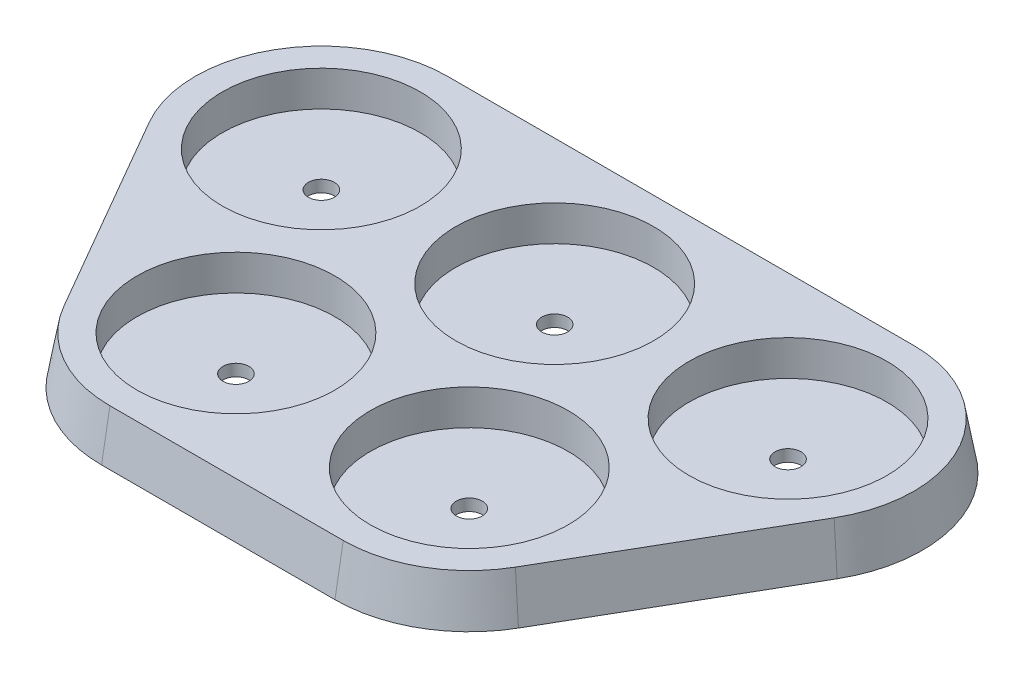
ISO-10303-21;
HEADER;
FILE_DESCRIPTION(('STEP AP214'),'2;1');
FILE_NAME('part.step','',(''),(''),'','','');
FILE_SCHEMA(('AUTOMOTIVE_DESIGN { 1 0 10303 214 1 1 1 1 }'));
ENDSEC;
DATA;
#1=APPLICATION_CONTEXT('core data for automotive mechanical design processes');
#2=APPLICATION_PROTOCOL_DEFINITION('international standard','automotive_design',2000,#1);
#3=PRODUCT_CONTEXT('',#1,'mechanical');
#4=PRODUCT('Part','Part','',(#3));
#5=PRODUCT_RELATED_PRODUCT_CATEGORY('part','',(#4));
#6=PRODUCT_DEFINITION_FORMATION('','',#4);
#7=PRODUCT_DEFINITION_CONTEXT('part definition',#1,'design');
#8=PRODUCT_DEFINITION('design','',#6,#7);
#9=PRODUCT_DEFINITION_SHAPE('','',#8);
#10=(LENGTH_UNIT() NAMED_UNIT(*) SI_UNIT(.MILLI.,.METRE.));
#11=(NAMED_UNIT(*) PLANE_ANGLE_UNIT() SI_UNIT($,.RADIAN.));
#12=(NAMED_UNIT(*) SI_UNIT($,.STERADIAN.) SOLID_ANGLE_UNIT());
#13=UNCERTAINTY_MEASURE_WITH_UNIT(LENGTH_MEASURE(1.E-05),#10,'distance_accuracy_value','');
#14=(GEOMETRIC_REPRESENTATION_CONTEXT(3) GLOBAL_UNCERTAINTY_ASSIGNED_CONTEXT((#13)) GLOBAL_UNIT_ASSIGNED_CONTEXT((#10,
#11,#12)) REPRESENTATION_CONTEXT('',''));
#15=CARTESIAN_POINT('',(0.,0.,0.));
#16=DIRECTION('',(0.,0.,1.));
#17=DIRECTION('',(1.,0.,0.));
#18=AXIS2_PLACEMENT_3D('',#15,#16,#17);
#19=CARTESIAN_POINT('',(-9.90000000000008,0.,17.1473029949318));
#20=DIRECTION('',(0.,1.,0.));
#21=DIRECTION('',(0.,0.,1.));
#22=AXIS2_PLACEMENT_3D('',#19,#20,#21);
#23=CYLINDRICAL_SURFACE('',#22,1.1);
#24=CARTESIAN_POINT('',(-9.90000000000008,0.,17.1473029949318));
#25=DIRECTION('',(0.,1.,0.));
#26=DIRECTION('',(0.,0.,1.));
#27=AXIS2_PLACEMENT_3D('',#24,#25,#26);
#28=CIRCLE('',#27,1.1);
#29=CARTESIAN_POINT('',(-9.90000000000008,0.,18.2473029949318));
#30=VERTEX_POINT('',#29);
#31=EDGE_CURVE('E154',#30,#30,#28,.T.);
#32=ORIENTED_EDGE('',*,*,#31,.F.);
#33=EDGE_LOOP('',(#32));
#34=FACE_BOUND('',#33,.T.);
#35=CARTESIAN_POINT('',(-9.90000000000008,1.,17.1473029949318));
#36=DIRECTION('',(0.,1.,0.));
#37=DIRECTION('',(0.,0.,1.));
#38=AXIS2_PLACEMENT_3D('',#35,#36,#37);
#39=CIRCLE('',#38,1.1);
#40=CARTESIAN_POINT('',(-9.90000000000008,1.,18.2473029949318));
#41=VERTEX_POINT('',#40);
#42=EDGE_CURVE('E336',#41,#41,#39,.T.);
#43=ORIENTED_EDGE('',*,*,#42,.T.);
#44=EDGE_LOOP('',(#43));
#45=FACE_BOUND('',#44,.T.);
#46=ADVANCED_FACE('F71',(#34,#45),#23,.F.);
#47=CARTESIAN_POINT('',(-19.7999999999998,0.,0.));
#48=DIRECTION('',(0.,1.,0.));
#49=DIRECTION('',(0.,0.,1.));
#50=AXIS2_PLACEMENT_3D('',#47,#48,#49);
#51=CYLINDRICAL_SURFACE('',#50,1.10000000000001);
#52=CARTESIAN_POINT('',(-19.7999999999998,0.,0.));
#53=DIRECTION('',(0.,1.,0.));
#54=DIRECTION('',(0.,0.,1.));
#55=AXIS2_PLACEMENT_3D('',#52,#53,#54);
#56=CIRCLE('',#55,1.10000000000001);
#57=CARTESIAN_POINT('',(-19.7999999999998,0.,1.10000000000001));
#58=VERTEX_POINT('',#57);
#59=EDGE_CURVE('E393',#58,#58,#56,.T.);
#60=ORIENTED_EDGE('',*,*,#59,.F.);
#61=EDGE_LOOP('',(#60));
#62=FACE_BOUND('',#61,.T.);
#63=CARTESIAN_POINT('',(-19.7999999999998,1.,0.));
#64=DIRECTION('',(0.,1.,0.));
#65=DIRECTION('',(0.,0.,1.));
#66=AXIS2_PLACEMENT_3D('',#63,#64,#65);
#67=CIRCLE('',#66,1.10000000000001);
#68=CARTESIAN_POINT('',(-19.7999999999998,1.,1.10000000000001));
#69=VERTEX_POINT('',#68);
#70=EDGE_CURVE('E341',#69,#69,#67,.T.);
#71=ORIENTED_EDGE('',*,*,#70,.T.);
#72=EDGE_LOOP('',(#71));
#73=FACE_BOUND('',#72,.T.);
#74=ADVANCED_FACE('F254',(#62,#73),#51,.F.);
#75=CARTESIAN_POINT('',(-39.5999999999999,0.,-2.72581957005969E-13));
#76=DIRECTION('',(0.,1.,0.));
#77=DIRECTION('',(0.,0.,1.));
#78=AXIS2_PLACEMENT_3D('',#75,#76,#77);
#79=CYLINDRICAL_SURFACE('',#78,1.10000000000001);
#80=CARTESIAN_POINT('',(-39.5999999999999,0.,-2.72581957005969E-13));
#81=DIRECTION('',(0.,1.,0.));
#82=DIRECTION('',(0.,0.,1.));
#83=AXIS2_PLACEMENT_3D('',#80,#81,#82);
#84=CIRCLE('',#83,1.10000000000001);
#85=CARTESIAN_POINT('',(-39.5999999999999,0.,1.09999999999974));
#86=VERTEX_POINT('',#85);
#87=EDGE_CURVE('E397',#86,#86,#84,.T.);
#88=ORIENTED_EDGE('',*,*,#87,.F.);
#89=EDGE_LOOP('',(#88));
#90=FACE_BOUND('',#89,.T.);
#91=CARTESIAN_POINT('',(-39.5999999999999,1.,-2.72581957005969E-13));
#92=DIRECTION('',(0.,1.,0.));
#93=DIRECTION('',(0.,0.,1.));
#94=AXIS2_PLACEMENT_3D('',#91,#92,#93);
#95=CIRCLE('',#94,1.10000000000001);
#96=CARTESIAN_POINT('',(-39.5999999999999,1.,1.09999999999974));
#97=VERTEX_POINT('',#96);
#98=EDGE_CURVE('E378',#97,#97,#95,.T.);
#99=ORIENTED_EDGE('',*,*,#98,.T.);
#100=EDGE_LOOP('',(#99));
#101=FACE_BOUND('',#100,.T.);
#102=ADVANCED_FACE('F260',(#90,#101),#79,.F.);
#103=CARTESIAN_POINT('',(-29.6999999999999,0.,17.1473029949318));
#104=DIRECTION('',(0.,1.,0.));
#105=DIRECTION('',(0.,0.,1.));
#106=AXIS2_PLACEMENT_3D('',#103,#104,#105);
#107=CYLINDRICAL_SURFACE('',#106,1.1);
#108=CARTESIAN_POINT('',(-29.6999999999999,0.,17.1473029949318));
#109=DIRECTION('',(0.,1.,0.));
#110=DIRECTION('',(0.,0.,1.));
#111=AXIS2_PLACEMENT_3D('',#108,#109,#110);
#112=CIRCLE('',#111,1.1);
#113=CARTESIAN_POINT('',(-29.6999999999999,0.,18.2473029949318));
#114=VERTEX_POINT('',#113);
#115=EDGE_CURVE('E401',#114,#114,#112,.T.);
#116=ORIENTED_EDGE('',*,*,#115,.F.);
#117=EDGE_LOOP('',(#116));
#118=FACE_BOUND('',#117,.T.);
#119=CARTESIAN_POINT('',(-29.6999999999999,1.,17.1473029949318));
#120=DIRECTION('',(0.,1.,0.));
#121=DIRECTION('',(0.,0.,1.));
#122=AXIS2_PLACEMENT_3D('',#119,#120,#121);
#123=CIRCLE('',#122,1.1);
#124=CARTESIAN_POINT('',(-29.6999999999999,1.,18.2473029949318));
#125=VERTEX_POINT('',#124);
#126=EDGE_CURVE('E366',#125,#125,#123,.T.);
#127=ORIENTED_EDGE('',*,*,#126,.T.);
#128=EDGE_LOOP('',(#127));
#129=FACE_BOUND('',#128,.T.);
#130=ADVANCED_FACE('F267',(#118,#129),#107,.F.);
#131=CARTESIAN_POINT('',(0.,0.,0.));
#132=DIRECTION('',(0.,1.,0.));
#133=DIRECTION('',(0.,0.,1.));
#134=AXIS2_PLACEMENT_3D('',#131,#132,#133);
#135=CYLINDRICAL_SURFACE('',#134,1.1);
#136=CARTESIAN_POINT('',(0.,0.,0.));
#137=DIRECTION('',(0.,1.,0.));
#138=DIRECTION('',(0.,0.,1.));
#139=AXIS2_PLACEMENT_3D('',#136,#137,#138);
#140=CIRCLE('',#139,1.1);
#141=CARTESIAN_POINT('',(0.,0.,1.1));
#142=VERTEX_POINT('',#141);
#143=EDGE_CURVE('E405',#142,#142,#140,.T.);
#144=ORIENTED_EDGE('',*,*,#143,.F.);
#145=EDGE_LOOP('',(#144));
#146=FACE_BOUND('',#145,.T.);
#147=CARTESIAN_POINT('',(0.,1.,0.));
#148=DIRECTION('',(0.,1.,0.));
#149=DIRECTION('',(0.,0.,1.));
#150=AXIS2_PLACEMENT_3D('',#147,#148,#149);
#151=CIRCLE('',#150,1.1);
#152=CARTESIAN_POINT('',(0.,1.,1.1));
#153=VERTEX_POINT('',#152);
#154=EDGE_CURVE('E353',#153,#153,#151,.T.);
#155=ORIENTED_EDGE('',*,*,#154,.T.);
#156=EDGE_LOOP('',(#155));
#157=FACE_BOUND('',#156,.T.);
#158=ADVANCED_FACE('F277',(#146,#157),#135,.F.);
#159=CARTESIAN_POINT('',(-9.90000000000008,0.,17.1473029949318));
#160=DIRECTION('',(0.,-1.,0.));
#161=DIRECTION('',(0.,0.,1.));
#162=AXIS2_PLACEMENT_3D('',#159,#160,#161);
#163=CONICAL_SURFACE('',#162,11.4,0.174532925199433);
#164=CARTESIAN_POINT('',(-9.90000000000008,0.,17.1473029949318));
#165=DIRECTION('',(0.,1.,0.));
#166=DIRECTION('',(0.,0.,1.));
#167=AXIS2_PLACEMENT_3D('',#164,#165,#166);
#168=CIRCLE('',#167,11.4);
#169=CARTESIAN_POINT('',(-9.90000000000008,0.,28.5473029949318));
#170=VERTEX_POINT('',#169);
#171=CARTESIAN_POINT('',(-0.0273103968575052,0.,22.8473029949319));
#172=VERTEX_POINT('',#171);
#173=EDGE_CURVE('E149',#170,#172,#168,.T.);
#174=ORIENTED_EDGE('',*,*,#173,.T.);
#175=DIRECTION('',(0.150383733180435,-0.984807753012208,0.0868240888334661));
#176=VECTOR('',#175,1.);
#177=CARTESIAN_POINT('',(-0.0273103968575027,0.,22.8473029949319));
#178=LINE('',#177,#176);
#179=CARTESIAN_POINT('',(-0.63812497552206,4.,22.494649033515));
#180=VERTEX_POINT('',#179);
#181=EDGE_CURVE('E12',#180,#172,#178,.T.);
#182=ORIENTED_EDGE('',*,*,#181,.F.);
#183=CARTESIAN_POINT('',(-9.90000000000008,4.,17.1473029949318));
#184=DIRECTION('',(0.,1.,0.));
#185=DIRECTION('',(0.,0.,1.));
#186=AXIS2_PLACEMENT_3D('',#183,#184,#185);
#187=CIRCLE('',#186,10.6946920771661);
#188=CARTESIAN_POINT('',(-9.90000000000008,4.,27.841995072098));
#189=VERTEX_POINT('',#188);
#190=EDGE_CURVE('E183',#189,#180,#187,.T.);
#191=ORIENTED_EDGE('',*,*,#190,.F.);
#192=DIRECTION('',(0.,-0.984807753012208,0.173648177666931));
#193=VECTOR('',#192,1.);
#194=CARTESIAN_POINT('',(-9.90000000000008,0.,28.5473029949318));
#195=LINE('',#194,#193);
#196=EDGE_CURVE('E89',#189,#170,#195,.T.);
#197=ORIENTED_EDGE('',*,*,#196,.T.);
#198=EDGE_LOOP('',(#174,#182,#191,#197));
#199=FACE_BOUND('',#198,.T.);
#200=ADVANCED_FACE('F150',(#199),#163,.T.);
#201=CARTESIAN_POINT('',(9.87268960314258,0.,5.70000000000005));
#202=DIRECTION('',(0.852868531952441,0.173648177666931,0.492403876506108));
#203=DIRECTION('',(0.500000000000004,0.,-0.866025403784436));
#204=AXIS2_PLACEMENT_3D('',#201,#202,#203);
#205=PLANE('',#204);
#206=DIRECTION('',(-0.500000000000004,0.,0.866025403784436));
#207=VECTOR('',#206,1.);
#208=CARTESIAN_POINT('',(9.87268960314258,0.,5.70000000000005));
#209=LINE('',#208,#207);
#210=CARTESIAN_POINT('',(9.87268960314258,0.,5.70000000000005));
#211=VERTEX_POINT('',#210);
#212=EDGE_CURVE('E144',#211,#172,#209,.T.);
#213=ORIENTED_EDGE('',*,*,#212,.F.);
#214=DIRECTION('',(0.150383733180435,-0.984807753012208,0.0868240888334661));
#215=VECTOR('',#214,1.);
#216=CARTESIAN_POINT('',(9.87268960314258,0.,5.70000000000004));
#217=LINE('',#216,#215);
#218=CARTESIAN_POINT('',(9.26187502447802,4.,5.34734603858311));
#219=VERTEX_POINT('',#218);
#220=EDGE_CURVE('E81',#219,#211,#217,.T.);
#221=ORIENTED_EDGE('',*,*,#220,.F.);
#222=DIRECTION('',(-0.500000000000004,0.,0.866025403784436));
#223=VECTOR('',#222,1.);
#224=CARTESIAN_POINT('',(9.26187502447802,4.,5.34734603858312));
#225=LINE('',#224,#223);
#226=EDGE_CURVE('E146',#219,#180,#225,.T.);
#227=ORIENTED_EDGE('',*,*,#226,.T.);
#228=ORIENTED_EDGE('',*,*,#181,.T.);
#229=EDGE_LOOP('',(#213,#221,#227,#228));
#230=FACE_BOUND('',#229,.T.);
#231=ADVANCED_FACE('F73',(#230),#205,.T.);
#232=CARTESIAN_POINT('',(0.,0.,0.));
#233=DIRECTION('',(0.,-1.,0.));
#234=DIRECTION('',(0.,0.,1.));
#235=AXIS2_PLACEMENT_3D('',#232,#233,#234);
#236=CONICAL_SURFACE('',#235,11.4,0.174532925199433);
#237=CARTESIAN_POINT('',(0.,0.,0.));
#238=DIRECTION('',(0.,1.,0.));
#239=DIRECTION('',(0.,0.,1.));
#240=AXIS2_PLACEMENT_3D('',#237,#238,#239);
#241=CIRCLE('',#240,11.4);
#242=CARTESIAN_POINT('',(0.,0.,-11.4));
#243=VERTEX_POINT('',#242);
#244=EDGE_CURVE('E159',#211,#243,#241,.T.);
#245=ORIENTED_EDGE('',*,*,#244,.T.);
#246=DIRECTION('',(0.,-0.984807753012208,-0.173648177666931));
#247=VECTOR('',#246,1.);
#248=CARTESIAN_POINT('',(0.,0.,-11.3999999999997));
#249=LINE('',#248,#247);
#250=CARTESIAN_POINT('',(0.,4.,-10.6946920771659));
#251=VERTEX_POINT('',#250);
#252=EDGE_CURVE('E200',#251,#243,#249,.T.);
#253=ORIENTED_EDGE('',*,*,#252,.F.);
#254=CARTESIAN_POINT('',(0.,4.,0.));
#255=DIRECTION('',(0.,1.,0.));
#256=DIRECTION('',(0.,0.,1.));
#257=AXIS2_PLACEMENT_3D('',#254,#255,#256);
#258=CIRCLE('',#257,10.6946920771661);
#259=EDGE_CURVE('E210',#219,#251,#258,.T.);
#260=ORIENTED_EDGE('',*,*,#259,.F.);
#261=ORIENTED_EDGE('',*,*,#220,.T.);
#262=EDGE_LOOP('',(#245,#253,#260,#261));
#263=FACE_BOUND('',#262,.T.);
#264=ADVANCED_FACE('F231',(#263),#236,.T.);
#265=CARTESIAN_POINT('',(1.57807268935826E-13,0.,-11.3999999999997));
#266=DIRECTION('',(0.,0.173648177666931,-0.984807753012208));
#267=DIRECTION('',(0.,0.984807753012208,0.173648177666931));
#268=AXIS2_PLACEMENT_3D('',#265,#266,#267);
#269=PLANE('',#268);
#270=DIRECTION('',(-1.,0.,0.));
#271=VECTOR('',#270,1.);
#272=CARTESIAN_POINT('',(1.57807268935826E-13,0.,-11.3999999999997));
#273=LINE('',#272,#271);
#274=CARTESIAN_POINT('',(-39.5999999999999,0.,-11.4000000000003));
#275=VERTEX_POINT('',#274);
#276=EDGE_CURVE('E163',#243,#275,#273,.T.);
#277=ORIENTED_EDGE('',*,*,#276,.T.);
#278=DIRECTION('',(0.,-0.984807753012208,-0.173648177666931));
#279=VECTOR('',#278,1.);
#280=CARTESIAN_POINT('',(-39.5999999999999,0.,-11.4000000000003));
#281=LINE('',#280,#279);
#282=CARTESIAN_POINT('',(-39.5999999999999,4.,-10.6946920771664));
#283=VERTEX_POINT('',#282);
#284=EDGE_CURVE('E196',#283,#275,#281,.T.);
#285=ORIENTED_EDGE('',*,*,#284,.F.);
#286=DIRECTION('',(1.,0.,0.));
#287=VECTOR('',#286,1.);
#288=CARTESIAN_POINT('',(1.48043872702386E-13,4.,-10.6946920771659));
#289=LINE('',#288,#287);
#290=EDGE_CURVE('E213',#251,#283,#289,.F.);
#291=ORIENTED_EDGE('',*,*,#290,.F.);
#292=ORIENTED_EDGE('',*,*,#252,.T.);
#293=EDGE_LOOP('',(#277,#285,#291,#292));
#294=FACE_BOUND('',#293,.T.);
#295=ADVANCED_FACE('F233',(#294),#269,.T.);
#296=CARTESIAN_POINT('',(-39.5999999999999,0.,-2.72581957005969E-13));
#297=DIRECTION('',(0.,-1.,0.));
#298=DIRECTION('',(0.,0.,1.));
#299=AXIS2_PLACEMENT_3D('',#296,#297,#298);
#300=CONICAL_SURFACE('',#299,11.4,0.174532925199433);
#301=CARTESIAN_POINT('',(-39.5999999999999,0.,-2.72581957005969E-13));
#302=DIRECTION('',(0.,1.,0.));
#303=DIRECTION('',(0.,0.,1.));
#304=AXIS2_PLACEMENT_3D('',#301,#302,#303);
#305=CIRCLE('',#304,11.4);
#306=CARTESIAN_POINT('',(-49.4726896031425,0.,5.69999999999964));
#307=VERTEX_POINT('',#306);
#308=EDGE_CURVE('E169',#275,#307,#305,.T.);
#309=ORIENTED_EDGE('',*,*,#308,.T.);
#310=DIRECTION('',(-0.150383733180436,-0.984807753012208,0.086824088833464));
#311=VECTOR('',#310,1.);
#312=CARTESIAN_POINT('',(-49.4726896031425,0.,5.69999999999964));
#313=LINE('',#312,#311);
#314=CARTESIAN_POINT('',(-48.8618750244779,4.,5.34734603858271));
#315=VERTEX_POINT('',#314);
#316=EDGE_CURVE('E193',#315,#307,#313,.T.);
#317=ORIENTED_EDGE('',*,*,#316,.F.);
#318=CARTESIAN_POINT('',(-39.5999999999999,4.,-2.72581957005969E-13));
#319=DIRECTION('',(0.,1.,0.));
#320=DIRECTION('',(0.,0.,1.));
#321=AXIS2_PLACEMENT_3D('',#318,#319,#320);
#322=CIRCLE('',#321,10.6946920771662);
#323=EDGE_CURVE('E216',#283,#315,#322,.T.);
#324=ORIENTED_EDGE('',*,*,#323,.F.);
#325=ORIENTED_EDGE('',*,*,#284,.T.);
#326=EDGE_LOOP('',(#309,#317,#324,#325));
#327=FACE_BOUND('',#326,.T.);
#328=ADVANCED_FACE('F238',(#327),#300,.T.);
#329=CARTESIAN_POINT('',(-39.5726896031427,0.,22.8473029949315));
#330=DIRECTION('',(-0.852868531952448,0.173648177666931,0.492403876506096));
#331=DIRECTION('',(0.499999999999992,0.,0.866025403784443));
#332=AXIS2_PLACEMENT_3D('',#329,#330,#331);
#333=PLANE('',#332);
#334=DIRECTION('',(-0.499999999999992,0.,-0.866025403784443));
#335=VECTOR('',#334,1.);
#336=CARTESIAN_POINT('',(-39.5726896031427,0.,22.8473029949315));
#337=LINE('',#336,#335);
#338=CARTESIAN_POINT('',(-39.5726896031426,0.,22.8473029949318));
#339=VERTEX_POINT('',#338);
#340=EDGE_CURVE('E173',#339,#307,#337,.T.);
#341=ORIENTED_EDGE('',*,*,#340,.F.);
#342=DIRECTION('',(-0.150383733180436,-0.984807753012208,0.086824088833464));
#343=VECTOR('',#342,1.);
#344=CARTESIAN_POINT('',(-39.5726896031426,0.,22.8473029949318));
#345=LINE('',#344,#343);
#346=CARTESIAN_POINT('',(-38.961875024478,4.,22.4946490335148));
#347=VERTEX_POINT('',#346);
#348=EDGE_CURVE('E190',#347,#339,#345,.T.);
#349=ORIENTED_EDGE('',*,*,#348,.F.);
#350=DIRECTION('',(-0.499999999999992,0.,-0.866025403784443));
#351=VECTOR('',#350,1.);
#352=CARTESIAN_POINT('',(-38.9618750244782,4.,22.4946490335145));
#353=LINE('',#352,#351);
#354=EDGE_CURVE('E219',#347,#315,#353,.T.);
#355=ORIENTED_EDGE('',*,*,#354,.T.);
#356=ORIENTED_EDGE('',*,*,#316,.T.);
#357=EDGE_LOOP('',(#341,#349,#355,#356));
#358=FACE_BOUND('',#357,.T.);
#359=ADVANCED_FACE('F241',(#358),#333,.T.);
#360=CARTESIAN_POINT('',(-29.6999999999999,0.,17.1473029949318));
#361=DIRECTION('',(0.,-1.,0.));
#362=DIRECTION('',(0.,0.,1.));
#363=AXIS2_PLACEMENT_3D('',#360,#361,#362);
#364=CONICAL_SURFACE('',#363,11.4,0.174532925199433);
#365=CARTESIAN_POINT('',(-29.6999999999999,0.,17.1473029949318));
#366=DIRECTION('',(0.,1.,0.));
#367=DIRECTION('',(0.,0.,1.));
#368=AXIS2_PLACEMENT_3D('',#365,#366,#367);
#369=CIRCLE('',#368,11.4);
#370=CARTESIAN_POINT('',(-29.6999999999999,0.,28.5473029949318));
#371=VERTEX_POINT('',#370);
#372=EDGE_CURVE('E177',#339,#371,#369,.T.);
#373=ORIENTED_EDGE('',*,*,#372,.T.);
#374=DIRECTION('',(0.,-0.984807753012208,0.173648177666931));
#375=VECTOR('',#374,1.);
#376=CARTESIAN_POINT('',(-29.6999999999999,0.,28.5473029949318));
#377=LINE('',#376,#375);
#378=CARTESIAN_POINT('',(-29.6999999999999,4.,27.841995072098));
#379=VERTEX_POINT('',#378);
#380=EDGE_CURVE('E187',#379,#371,#377,.T.);
#381=ORIENTED_EDGE('',*,*,#380,.F.);
#382=CARTESIAN_POINT('',(-29.6999999999999,4.,17.1473029949318));
#383=DIRECTION('',(0.,1.,0.));
#384=DIRECTION('',(0.,0.,1.));
#385=AXIS2_PLACEMENT_3D('',#382,#383,#384);
#386=CIRCLE('',#385,10.6946920771661);
#387=EDGE_CURVE('E97',#347,#379,#386,.T.);
#388=ORIENTED_EDGE('',*,*,#387,.F.);
#389=ORIENTED_EDGE('',*,*,#348,.T.);
#390=EDGE_LOOP('',(#373,#381,#388,#389));
#391=FACE_BOUND('',#390,.T.);
#392=ADVANCED_FACE('F244',(#391),#364,.T.);
#393=CARTESIAN_POINT('',(0.,0.,28.5473029949318));
#394=DIRECTION('',(0.,0.173648177666931,0.984807753012208));
#395=DIRECTION('',(0.,-0.984807753012208,0.173648177666931));
#396=AXIS2_PLACEMENT_3D('',#393,#394,#395);
#397=PLANE('',#396);
#398=DIRECTION('',(-1.,0.,0.));
#399=VECTOR('',#398,1.);
#400=CARTESIAN_POINT('',(0.,0.,28.5473029949318));
#401=LINE('',#400,#399);
#402=EDGE_CURVE('E181',#170,#371,#401,.T.);
#403=ORIENTED_EDGE('',*,*,#402,.F.);
#404=ORIENTED_EDGE('',*,*,#196,.F.);
#405=DIRECTION('',(-1.,0.,0.));
#406=VECTOR('',#405,1.);
#407=CARTESIAN_POINT('',(0.,4.,27.841995072098));
#408=LINE('',#407,#406);
#409=EDGE_CURVE('E75',#189,#379,#408,.T.);
#410=ORIENTED_EDGE('',*,*,#409,.T.);
#411=ORIENTED_EDGE('',*,*,#380,.T.);
#412=EDGE_LOOP('',(#403,#404,#410,#411));
#413=FACE_BOUND('',#412,.T.);
#414=ADVANCED_FACE('F224',(#413),#397,.T.);
#415=CARTESIAN_POINT('',(0.,4.,0.));
#416=DIRECTION('',(0.,1.,0.));
#417=DIRECTION('',(0.,0.,1.));
#418=AXIS2_PLACEMENT_3D('',#415,#416,#417);
#419=PLANE('',#418);
#420=CARTESIAN_POINT('',(-39.5999999999999,4.,-2.72581957005969E-13));
#421=DIRECTION('',(0.,1.,0.));
#422=DIRECTION('',(0.,0.,1.));
#423=AXIS2_PLACEMENT_3D('',#420,#421,#422);
#424=CIRCLE('',#423,8.40000000000002);
#425=CARTESIAN_POINT('',(-39.5999999999999,4.,8.39999999999974));
#426=VERTEX_POINT('',#425);
#427=EDGE_CURVE('E382',#426,#426,#424,.T.);
#428=ORIENTED_EDGE('',*,*,#427,.F.);
#429=EDGE_LOOP('',(#428));
#430=FACE_BOUND('',#429,.T.);
#431=CARTESIAN_POINT('',(-29.6999999999999,4.,17.1473029949318));
#432=DIRECTION('',(0.,1.,0.));
#433=DIRECTION('',(0.,0.,1.));
#434=AXIS2_PLACEMENT_3D('',#431,#432,#433);
#435=CIRCLE('',#434,8.4);
#436=CARTESIAN_POINT('',(-29.6999999999999,4.,25.5473029949318));
#437=VERTEX_POINT('',#436);
#438=EDGE_CURVE('E370',#437,#437,#435,.T.);
#439=ORIENTED_EDGE('',*,*,#438,.F.);
#440=EDGE_LOOP('',(#439));
#441=FACE_BOUND('',#440,.T.);
#442=CARTESIAN_POINT('',(0.,4.,0.));
#443=DIRECTION('',(0.,1.,0.));
#444=DIRECTION('',(0.,0.,1.));
#445=AXIS2_PLACEMENT_3D('',#442,#443,#444);
#446=CIRCLE('',#445,8.4);
#447=CARTESIAN_POINT('',(0.,4.,8.4));
#448=VERTEX_POINT('',#447);
#449=EDGE_CURVE('E357',#448,#448,#446,.T.);
#450=ORIENTED_EDGE('',*,*,#449,.F.);
#451=EDGE_LOOP('',(#450));
#452=FACE_BOUND('',#451,.T.);
#453=CARTESIAN_POINT('',(-9.90000000000008,4.,17.1473029949318));
#454=DIRECTION('',(0.,1.,0.));
#455=DIRECTION('',(0.,0.,1.));
#456=AXIS2_PLACEMENT_3D('',#453,#454,#455);
#457=CIRCLE('',#456,8.4);
#458=CARTESIAN_POINT('',(-9.90000000000008,4.,25.5473029949318));
#459=VERTEX_POINT('',#458);
#460=EDGE_CURVE('E342',#459,#459,#457,.T.);
#461=ORIENTED_EDGE('',*,*,#460,.F.);
#462=EDGE_LOOP('',(#461));
#463=FACE_BOUND('',#462,.T.);
#464=CARTESIAN_POINT('',(-19.7999999999998,4.,0.));
#465=DIRECTION('',(0.,1.,0.));
#466=DIRECTION('',(0.,0.,1.));
#467=AXIS2_PLACEMENT_3D('',#464,#465,#466);
#468=CIRCLE('',#467,8.40000000000001);
#469=CARTESIAN_POINT('',(-19.7999999999998,4.,8.40000000000001));
#470=VERTEX_POINT('',#469);
#471=EDGE_CURVE('E347',#470,#470,#468,.T.);
#472=ORIENTED_EDGE('',*,*,#471,.F.);
#473=EDGE_LOOP('',(#472));
#474=FACE_BOUND('',#473,.T.);
#475=ORIENTED_EDGE('',*,*,#190,.T.);
#476=ORIENTED_EDGE('',*,*,#226,.F.);
#477=ORIENTED_EDGE('',*,*,#259,.T.);
#478=ORIENTED_EDGE('',*,*,#290,.T.);
#479=ORIENTED_EDGE('',*,*,#323,.T.);
#480=ORIENTED_EDGE('',*,*,#354,.F.);
#481=ORIENTED_EDGE('',*,*,#387,.T.);
#482=ORIENTED_EDGE('',*,*,#409,.F.);
#483=EDGE_LOOP('',(#475,#476,#477,#478,#479,#480,#481,#482));
#484=FACE_BOUND('',#483,.T.);
#485=ADVANCED_FACE('F225',(#430,#441,#452,#463,#474,#484),#419,.T.);
#486=CARTESIAN_POINT('',(0.,0.,0.));
#487=DIRECTION('',(0.,1.,0.));
#488=DIRECTION('',(0.,0.,1.));
#489=AXIS2_PLACEMENT_3D('',#486,#487,#488);
#490=PLANE('',#489);
#491=ORIENTED_EDGE('',*,*,#143,.T.);
#492=EDGE_LOOP('',(#491));
#493=FACE_BOUND('',#492,.T.);
#494=ORIENTED_EDGE('',*,*,#115,.T.);
#495=EDGE_LOOP('',(#494));
#496=FACE_BOUND('',#495,.T.);
#497=ORIENTED_EDGE('',*,*,#87,.T.);
#498=EDGE_LOOP('',(#497));
#499=FACE_BOUND('',#498,.T.);
#500=ORIENTED_EDGE('',*,*,#59,.T.);
#501=EDGE_LOOP('',(#500));
#502=FACE_BOUND('',#501,.T.);
#503=ORIENTED_EDGE('',*,*,#31,.T.);
#504=EDGE_LOOP('',(#503));
#505=FACE_BOUND('',#504,.T.);
#506=ORIENTED_EDGE('',*,*,#173,.F.);
#507=ORIENTED_EDGE('',*,*,#402,.T.);
#508=ORIENTED_EDGE('',*,*,#372,.F.);
#509=ORIENTED_EDGE('',*,*,#340,.T.);
#510=ORIENTED_EDGE('',*,*,#308,.F.);
#511=ORIENTED_EDGE('',*,*,#276,.F.);
#512=ORIENTED_EDGE('',*,*,#244,.F.);
#513=ORIENTED_EDGE('',*,*,#212,.T.);
#514=EDGE_LOOP('',(#506,#507,#508,#509,#510,#511,#512,#513));
#515=FACE_BOUND('',#514,.T.);
#516=ADVANCED_FACE('F157',(#493,#496,#499,#502,#505,#515),#490,.F.);
#517=CARTESIAN_POINT('',(0.,1.,0.));
#518=DIRECTION('',(0.,1.,0.));
#519=DIRECTION('',(0.,0.,1.));
#520=AXIS2_PLACEMENT_3D('',#517,#518,#519);
#521=CYLINDRICAL_SURFACE('',#520,8.4);
#522=CARTESIAN_POINT('',(0.,1.,0.));
#523=DIRECTION('',(0.,1.,0.));
#524=DIRECTION('',(0.,0.,1.));
#525=AXIS2_PLACEMENT_3D('',#522,#523,#524);
#526=CIRCLE('',#525,8.4);
#527=CARTESIAN_POINT('',(0.,1.,8.4));
#528=VERTEX_POINT('',#527);
#529=EDGE_CURVE('E359',#528,#528,#526,.T.);
#530=ORIENTED_EDGE('',*,*,#529,.F.);
#531=EDGE_LOOP('',(#530));
#532=FACE_BOUND('',#531,.T.);
#533=ORIENTED_EDGE('',*,*,#449,.T.);
#534=EDGE_LOOP('',(#533));
#535=FACE_BOUND('',#534,.T.);
#536=ADVANCED_FACE('F274',(#532,#535),#521,.F.);
#537=CARTESIAN_POINT('',(0.,1.,0.));
#538=DIRECTION('',(0.,1.,0.));
#539=DIRECTION('',(0.,0.,1.));
#540=AXIS2_PLACEMENT_3D('',#537,#538,#539);
#541=PLANE('',#540);
#542=ORIENTED_EDGE('',*,*,#154,.F.);
#543=EDGE_LOOP('',(#542));
#544=FACE_BOUND('',#543,.T.);
#545=ORIENTED_EDGE('',*,*,#529,.T.);
#546=EDGE_LOOP('',(#545));
#547=FACE_BOUND('',#546,.T.);
#548=ADVANCED_FACE('F314',(#544,#547),#541,.T.);
#549=CARTESIAN_POINT('',(-29.6999999999999,1.,17.1473029949318));
#550=DIRECTION('',(0.,1.,0.));
#551=DIRECTION('',(0.,0.,1.));
#552=AXIS2_PLACEMENT_3D('',#549,#550,#551);
#553=CYLINDRICAL_SURFACE('',#552,8.4);
#554=CARTESIAN_POINT('',(-29.6999999999999,1.,17.1473029949318));
#555=DIRECTION('',(0.,1.,0.));
#556=DIRECTION('',(0.,0.,1.));
#557=AXIS2_PLACEMENT_3D('',#554,#555,#556);
#558=CIRCLE('',#557,8.4);
#559=CARTESIAN_POINT('',(-29.6999999999999,1.,25.5473029949318));
#560=VERTEX_POINT('',#559);
#561=EDGE_CURVE('E358',#560,#560,#558,.T.);
#562=ORIENTED_EDGE('',*,*,#561,.F.);
#563=EDGE_LOOP('',(#562));
#564=FACE_BOUND('',#563,.T.);
#565=ORIENTED_EDGE('',*,*,#438,.T.);
#566=EDGE_LOOP('',(#565));
#567=FACE_BOUND('',#566,.T.);
#568=ADVANCED_FACE('F311',(#564,#567),#553,.F.);
#569=CARTESIAN_POINT('',(-29.6999999999999,1.,17.1473029949318));
#570=DIRECTION('',(0.,1.,0.));
#571=DIRECTION('',(0.,0.,1.));
#572=AXIS2_PLACEMENT_3D('',#569,#570,#571);
#573=PLANE('',#572);
#574=ORIENTED_EDGE('',*,*,#126,.F.);
#575=EDGE_LOOP('',(#574));
#576=FACE_BOUND('',#575,.T.);
#577=ORIENTED_EDGE('',*,*,#561,.T.);
#578=EDGE_LOOP('',(#577));
#579=FACE_BOUND('',#578,.T.);
#580=ADVANCED_FACE('F306',(#576,#579),#573,.T.);
#581=CARTESIAN_POINT('',(-39.5999999999999,1.,-2.72581957005969E-13));
#582=DIRECTION('',(0.,1.,0.));
#583=DIRECTION('',(0.,0.,1.));
#584=AXIS2_PLACEMENT_3D('',#581,#582,#583);
#585=CYLINDRICAL_SURFACE('',#584,8.40000000000002);
#586=CARTESIAN_POINT('',(-39.5999999999999,1.,-2.72581957005969E-13));
#587=DIRECTION('',(0.,1.,0.));
#588=DIRECTION('',(0.,0.,1.));
#589=AXIS2_PLACEMENT_3D('',#586,#587,#588);
#590=CIRCLE('',#589,8.40000000000002);
#591=CARTESIAN_POINT('',(-39.5999999999999,1.,8.39999999999974));
#592=VERTEX_POINT('',#591);
#593=EDGE_CURVE('E371',#592,#592,#590,.T.);
#594=ORIENTED_EDGE('',*,*,#593,.F.);
#595=EDGE_LOOP('',(#594));
#596=FACE_BOUND('',#595,.T.);
#597=ORIENTED_EDGE('',*,*,#427,.T.);
#598=EDGE_LOOP('',(#597));
#599=FACE_BOUND('',#598,.T.);
#600=ADVANCED_FACE('F303',(#596,#599),#585,.F.);
#601=CARTESIAN_POINT('',(-39.5999999999999,1.,-2.72581957005969E-13));
#602=DIRECTION('',(0.,1.,0.));
#603=DIRECTION('',(0.,0.,1.));
#604=AXIS2_PLACEMENT_3D('',#601,#602,#603);
#605=PLANE('',#604);
#606=ORIENTED_EDGE('',*,*,#98,.F.);
#607=EDGE_LOOP('',(#606));
#608=FACE_BOUND('',#607,.T.);
#609=ORIENTED_EDGE('',*,*,#593,.T.);
#610=EDGE_LOOP('',(#609));
#611=FACE_BOUND('',#610,.T.);
#612=ADVANCED_FACE('F297',(#608,#611),#605,.T.);
#613=CARTESIAN_POINT('',(-19.7999999999998,1.,0.));
#614=DIRECTION('',(0.,1.,0.));
#615=DIRECTION('',(0.,0.,1.));
#616=AXIS2_PLACEMENT_3D('',#613,#614,#615);
#617=CYLINDRICAL_SURFACE('',#616,8.40000000000001);
#618=CARTESIAN_POINT('',(-19.7999999999998,1.,0.));
#619=DIRECTION('',(0.,1.,0.));
#620=DIRECTION('',(0.,0.,1.));
#621=AXIS2_PLACEMENT_3D('',#618,#619,#620);
#622=CIRCLE('',#621,8.40000000000001);
#623=CARTESIAN_POINT('',(-19.7999999999998,1.,8.40000000000001));
#624=VERTEX_POINT('',#623);
#625=EDGE_CURVE('E389',#624,#624,#622,.T.);
#626=ORIENTED_EDGE('',*,*,#625,.F.);
#627=EDGE_LOOP('',(#626));
#628=FACE_BOUND('',#627,.T.);
#629=ORIENTED_EDGE('',*,*,#471,.T.);
#630=EDGE_LOOP('',(#629));
#631=FACE_BOUND('',#630,.T.);
#632=ADVANCED_FACE('F293',(#628,#631),#617,.F.);
#633=CARTESIAN_POINT('',(-19.7999999999998,1.,0.));
#634=DIRECTION('',(0.,1.,0.));
#635=DIRECTION('',(0.,0.,1.));
#636=AXIS2_PLACEMENT_3D('',#633,#634,#635);
#637=PLANE('',#636);
#638=ORIENTED_EDGE('',*,*,#70,.F.);
#639=EDGE_LOOP('',(#638));
#640=FACE_BOUND('',#639,.T.);
#641=ORIENTED_EDGE('',*,*,#625,.T.);
#642=EDGE_LOOP('',(#641));
#643=FACE_BOUND('',#642,.T.);
#644=ADVANCED_FACE('F296',(#640,#643),#637,.T.);
#645=CARTESIAN_POINT('',(-9.90000000000008,1.,17.1473029949318));
#646=DIRECTION('',(0.,1.,0.));
#647=DIRECTION('',(0.,0.,1.));
#648=AXIS2_PLACEMENT_3D('',#645,#646,#647);
#649=CYLINDRICAL_SURFACE('',#648,8.4);
#650=CARTESIAN_POINT('',(-9.90000000000008,1.,17.1473029949318));
#651=DIRECTION('',(0.,1.,0.));
#652=DIRECTION('',(0.,0.,1.));
#653=AXIS2_PLACEMENT_3D('',#650,#651,#652);
#654=CIRCLE('',#653,8.4);
#655=CARTESIAN_POINT('',(-9.90000000000008,1.,25.5473029949318));
#656=VERTEX_POINT('',#655);
#657=EDGE_CURVE('E339',#656,#656,#654,.T.);
#658=ORIENTED_EDGE('',*,*,#657,.F.);
#659=EDGE_LOOP('',(#658));
#660=FACE_BOUND('',#659,.T.);
#661=ORIENTED_EDGE('',*,*,#460,.T.);
#662=EDGE_LOOP('',(#661));
#663=FACE_BOUND('',#662,.T.);
#664=ADVANCED_FACE('F301',(#660,#663),#649,.F.);
#665=CARTESIAN_POINT('',(-9.90000000000008,1.,17.1473029949318));
#666=DIRECTION('',(0.,1.,0.));
#667=DIRECTION('',(0.,0.,1.));
#668=AXIS2_PLACEMENT_3D('',#665,#666,#667);
#669=PLANE('',#668);
#670=ORIENTED_EDGE('',*,*,#42,.F.);
#671=EDGE_LOOP('',(#670));
#672=FACE_BOUND('',#671,.T.);
#673=ORIENTED_EDGE('',*,*,#657,.T.);
#674=EDGE_LOOP('',(#673));
#675=FACE_BOUND('',#674,.T.);
#676=ADVANCED_FACE('F327',(#672,#675),#669,.T.);
#677=CLOSED_SHELL('',(#46,#74,#102,#130,#158,#200,#231,#264,#295,#328,#359,#392,#414,#485,#516,
#536,#548,#568,#580,#600,#612,#632,#644,#664,#676));
#678=MANIFOLD_SOLID_BREP('B2',#677);
#679=ADVANCED_BREP_SHAPE_REPRESENTATION('',(#18,#678),#14);
#680=SHAPE_DEFINITION_REPRESENTATION(#9,#679);
ENDSEC;
END-ISO-10303-21;
